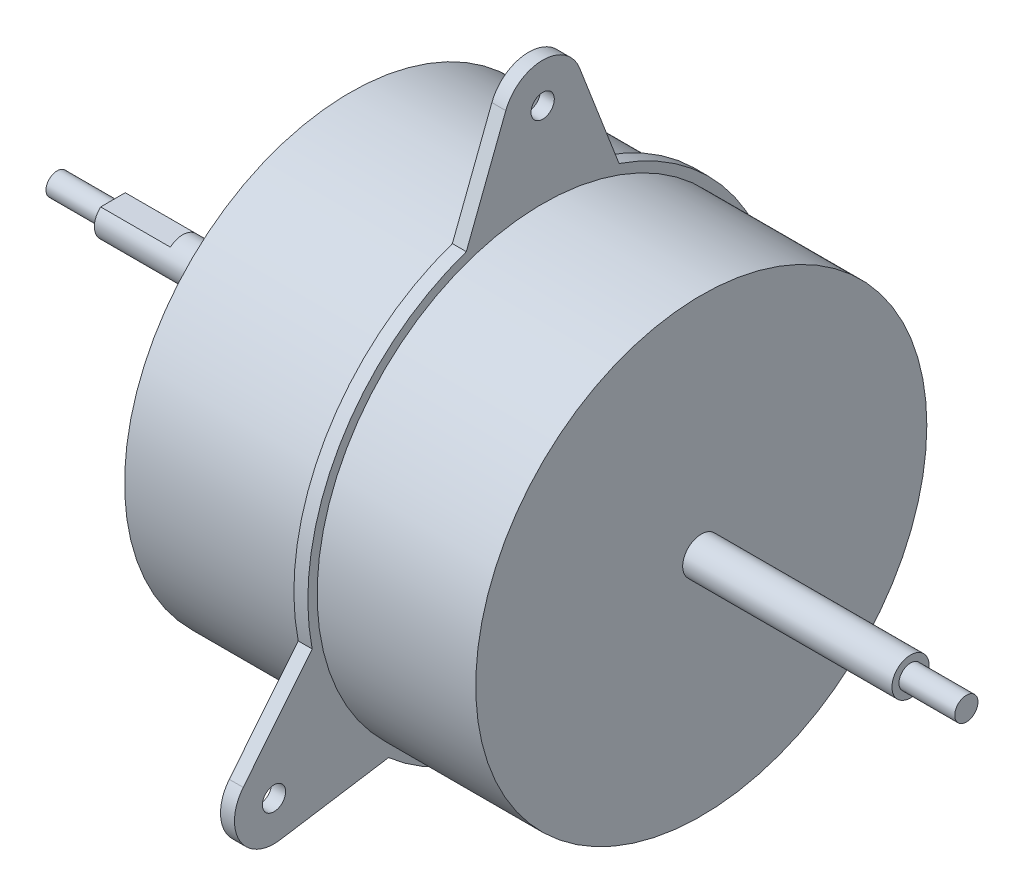
ISO-10303-21;
HEADER;
FILE_DESCRIPTION(('STEP AP214'),'2;1');
FILE_NAME('part.step','',(''),(''),'','','');
FILE_SCHEMA(('AUTOMOTIVE_DESIGN { 1 0 10303 214 1 1 1 1 }'));
ENDSEC;
DATA;
#1=APPLICATION_CONTEXT('core data for automotive mechanical design processes');
#2=APPLICATION_PROTOCOL_DEFINITION('international standard','automotive_design',2000,#1);
#3=PRODUCT_CONTEXT('',#1,'mechanical');
#4=PRODUCT('Part','Part','',(#3));
#5=PRODUCT_RELATED_PRODUCT_CATEGORY('part','',(#4));
#6=PRODUCT_DEFINITION_FORMATION('','',#4);
#7=PRODUCT_DEFINITION_CONTEXT('part definition',#1,'design');
#8=PRODUCT_DEFINITION('design','',#6,#7);
#9=PRODUCT_DEFINITION_SHAPE('','',#8);
#10=(LENGTH_UNIT() NAMED_UNIT(*) SI_UNIT(.MILLI.,.METRE.));
#11=(NAMED_UNIT(*) PLANE_ANGLE_UNIT() SI_UNIT($,.RADIAN.));
#12=(NAMED_UNIT(*) SI_UNIT($,.STERADIAN.) SOLID_ANGLE_UNIT());
#13=UNCERTAINTY_MEASURE_WITH_UNIT(LENGTH_MEASURE(1.E-05),#10,'distance_accuracy_value','');
#14=(GEOMETRIC_REPRESENTATION_CONTEXT(3) GLOBAL_UNCERTAINTY_ASSIGNED_CONTEXT((#13)) GLOBAL_UNIT_ASSIGNED_CONTEXT((#10,
#11,#12)) REPRESENTATION_CONTEXT('',''));
#15=CARTESIAN_POINT('',(0.,0.,0.));
#16=DIRECTION('',(0.,0.,1.));
#17=DIRECTION('',(1.,0.,0.));
#18=AXIS2_PLACEMENT_3D('',#15,#16,#17);
#19=CARTESIAN_POINT('',(94.1,2.5,0.));
#20=DIRECTION('',(1.,0.,0.));
#21=DIRECTION('',(0.,0.,-1.));
#22=AXIS2_PLACEMENT_3D('',#19,#20,#21);
#23=PLANE('',#22);
#24=CARTESIAN_POINT('',(94.1,0.,0.));
#25=DIRECTION('',(1.,0.,0.));
#26=DIRECTION('',(0.,0.,-1.));
#27=AXIS2_PLACEMENT_3D('',#24,#25,#26);
#28=CIRCLE('',#27,2.5);
#29=CARTESIAN_POINT('',(94.1,0.,-2.5));
#30=VERTEX_POINT('',#29);
#31=EDGE_CURVE('E231',#30,#30,#28,.T.);
#32=ORIENTED_EDGE('',*,*,#31,.T.);
#33=EDGE_LOOP('',(#32));
#34=FACE_BOUND('',#33,.T.);
#35=ADVANCED_FACE('F33',(#34),#23,.T.);
#36=CARTESIAN_POINT('',(0.,0.,0.));
#37=DIRECTION('',(1.,0.,0.));
#38=DIRECTION('',(0.,0.,-1.));
#39=AXIS2_PLACEMENT_3D('',#36,#37,#38);
#40=CYLINDRICAL_SURFACE('',#39,2.5);
#41=CARTESIAN_POINT('',(82.1,0.,0.));
#42=DIRECTION('',(1.,0.,0.));
#43=DIRECTION('',(0.,0.,-1.));
#44=AXIS2_PLACEMENT_3D('',#41,#42,#43);
#45=CIRCLE('',#44,2.5);
#46=CARTESIAN_POINT('',(82.1,0.,-2.5));
#47=VERTEX_POINT('',#46);
#48=EDGE_CURVE('E228',#47,#47,#45,.T.);
#49=ORIENTED_EDGE('',*,*,#48,.T.);
#50=EDGE_LOOP('',(#49));
#51=FACE_BOUND('',#50,.T.);
#52=ORIENTED_EDGE('',*,*,#31,.F.);
#53=EDGE_LOOP('',(#52));
#54=FACE_BOUND('',#53,.T.);
#55=ADVANCED_FACE('F348',(#51,#54),#40,.T.);
#56=CARTESIAN_POINT('',(82.1,4.,0.));
#57=DIRECTION('',(1.,0.,0.));
#58=DIRECTION('',(0.,0.,-1.));
#59=AXIS2_PLACEMENT_3D('',#56,#57,#58);
#60=PLANE('',#59);
#61=CARTESIAN_POINT('',(82.1,0.,0.));
#62=DIRECTION('',(1.,0.,0.));
#63=DIRECTION('',(0.,0.,-1.));
#64=AXIS2_PLACEMENT_3D('',#61,#62,#63);
#65=CIRCLE('',#64,4.);
#66=CARTESIAN_POINT('',(82.1,0.,-4.));
#67=VERTEX_POINT('',#66);
#68=EDGE_CURVE('E225',#67,#67,#65,.T.);
#69=ORIENTED_EDGE('',*,*,#68,.T.);
#70=EDGE_LOOP('',(#69));
#71=FACE_BOUND('',#70,.T.);
#72=ORIENTED_EDGE('',*,*,#48,.F.);
#73=EDGE_LOOP('',(#72));
#74=FACE_BOUND('',#73,.T.);
#75=ADVANCED_FACE('F354',(#71,#74),#60,.T.);
#76=CARTESIAN_POINT('',(0.,0.,0.));
#77=DIRECTION('',(1.,0.,0.));
#78=DIRECTION('',(0.,0.,-1.));
#79=AXIS2_PLACEMENT_3D('',#76,#77,#78);
#80=CYLINDRICAL_SURFACE('',#79,4.);
#81=CARTESIAN_POINT('',(37.1,0.,0.));
#82=DIRECTION('',(1.,0.,0.));
#83=DIRECTION('',(0.,0.,-1.));
#84=AXIS2_PLACEMENT_3D('',#81,#82,#83);
#85=CIRCLE('',#84,4.);
#86=CARTESIAN_POINT('',(37.1,0.,-4.));
#87=VERTEX_POINT('',#86);
#88=EDGE_CURVE('E222',#87,#87,#85,.T.);
#89=ORIENTED_EDGE('',*,*,#88,.T.);
#90=EDGE_LOOP('',(#89));
#91=FACE_BOUND('',#90,.T.);
#92=ORIENTED_EDGE('',*,*,#68,.F.);
#93=EDGE_LOOP('',(#92));
#94=FACE_BOUND('',#93,.T.);
#95=ADVANCED_FACE('F407',(#91,#94),#80,.T.);
#96=CARTESIAN_POINT('',(37.1,48.5,0.));
#97=DIRECTION('',(1.,0.,0.));
#98=DIRECTION('',(0.,0.,-1.));
#99=AXIS2_PLACEMENT_3D('',#96,#97,#98);
#100=PLANE('',#99);
#101=CARTESIAN_POINT('',(37.1,0.,0.));
#102=DIRECTION('',(1.,0.,0.));
#103=DIRECTION('',(0.,0.,-1.));
#104=AXIS2_PLACEMENT_3D('',#101,#102,#103);
#105=CIRCLE('',#104,48.5);
#106=CARTESIAN_POINT('',(37.1,0.,-48.5));
#107=VERTEX_POINT('',#106);
#108=EDGE_CURVE('E219',#107,#107,#105,.T.);
#109=ORIENTED_EDGE('',*,*,#108,.T.);
#110=EDGE_LOOP('',(#109));
#111=FACE_BOUND('',#110,.T.);
#112=ORIENTED_EDGE('',*,*,#88,.F.);
#113=EDGE_LOOP('',(#112));
#114=FACE_BOUND('',#113,.T.);
#115=ADVANCED_FACE('F399',(#111,#114),#100,.T.);
#116=CARTESIAN_POINT('',(0.,0.,0.));
#117=DIRECTION('',(1.,0.,0.));
#118=DIRECTION('',(0.,0.,-1.));
#119=AXIS2_PLACEMENT_3D('',#116,#117,#118);
#120=CYLINDRICAL_SURFACE('',#119,48.5);
#121=CARTESIAN_POINT('',(3.,0.,0.));
#122=DIRECTION('',(1.,0.,0.));
#123=DIRECTION('',(0.,0.,-1.));
#124=AXIS2_PLACEMENT_3D('',#121,#122,#123);
#125=CIRCLE('',#124,48.5);
#126=CARTESIAN_POINT('',(3.,0.,-48.5));
#127=VERTEX_POINT('',#126);
#128=EDGE_CURVE('E11',#127,#127,#125,.F.);
#129=ORIENTED_EDGE('',*,*,#128,.F.);
#130=EDGE_LOOP('',(#129));
#131=FACE_BOUND('',#130,.T.);
#132=ORIENTED_EDGE('',*,*,#108,.F.);
#133=EDGE_LOOP('',(#132));
#134=FACE_BOUND('',#133,.T.);
#135=ADVANCED_FACE('F389',(#131,#134),#120,.T.);
#136=CARTESIAN_POINT('',(3.,66.7128236048613,0.));
#137=DIRECTION('',(1.,0.,0.));
#138=DIRECTION('',(0.,0.,-1.));
#139=AXIS2_PLACEMENT_3D('',#136,#137,#138);
#140=PLANE('',#139);
#141=ORIENTED_EDGE('',*,*,#128,.T.);
#142=EDGE_LOOP('',(#141));
#143=FACE_BOUND('',#142,.T.);
#144=CARTESIAN_POINT('',(3.,-33.3564118024306,-57.775));
#145=DIRECTION('',(1.,0.,0.));
#146=DIRECTION('',(0.,0.,-1.));
#147=AXIS2_PLACEMENT_3D('',#144,#145,#146);
#148=CIRCLE('',#147,2.5);
#149=CARTESIAN_POINT('',(3.,-33.3564118024306,-60.275));
#150=VERTEX_POINT('',#149);
#151=EDGE_CURVE('E281',#150,#150,#148,.T.);
#152=ORIENTED_EDGE('',*,*,#151,.F.);
#153=EDGE_LOOP('',(#152));
#154=FACE_BOUND('',#153,.T.);
#155=CARTESIAN_POINT('',(3.,66.7128236048613,0.));
#156=DIRECTION('',(1.,0.,0.));
#157=DIRECTION('',(0.,0.,-1.));
#158=AXIS2_PLACEMENT_3D('',#155,#156,#157);
#159=CIRCLE('',#158,8.50000000000001);
#160=CARTESIAN_POINT('',(3.,69.7715028253181,-7.93060410223244));
#161=VERTEX_POINT('',#160);
#162=CARTESIAN_POINT('',(3.,69.771502825318,7.93060410223244));
#163=VERTEX_POINT('',#162);
#164=EDGE_CURVE('E191',#161,#163,#159,.T.);
#165=ORIENTED_EDGE('',*,*,#164,.T.);
#166=DIRECTION('',(0.,-0.933012247321463,0.359844614171387));
#167=VECTOR('',#166,1.);
#168=CARTESIAN_POINT('',(3.,69.771502825318,7.93060410223244));
#169=LINE('',#168,#167);
#170=CARTESIAN_POINT('',(3.,47.7553606400767,16.42180045355));
#171=VERTEX_POINT('',#170);
#172=EDGE_CURVE('E110',#163,#171,#169,.T.);
#173=ORIENTED_EDGE('',*,*,#172,.T.);
#174=CARTESIAN_POINT('',(3.,0.,0.));
#175=DIRECTION('',(1.,0.,0.));
#176=DIRECTION('',(0.,0.,-1.));
#177=AXIS2_PLACEMENT_3D('',#174,#175,#176);
#178=CIRCLE('',#177,50.5);
#179=CARTESIAN_POINT('',(3.,-9.65598395138592,49.5682557079688));
#180=VERTEX_POINT('',#179);
#181=EDGE_CURVE('E290',#171,#180,#178,.T.);
#182=ORIENTED_EDGE('',*,*,#181,.T.);
#183=DIRECTION('',(0.,-0.778140700948149,0.628090001136718));
#184=VECTOR('',#183,1.);
#185=CARTESIAN_POINT('',(3.,-28.0176467927686,64.3891959580592));
#186=LINE('',#185,#184);
#187=CARTESIAN_POINT('',(3.,-28.0176467927686,64.3891959580592));
#188=VERTEX_POINT('',#187);
#189=EDGE_CURVE('E292',#180,#188,#186,.T.);
#190=ORIENTED_EDGE('',*,*,#189,.T.);
#191=CARTESIAN_POINT('',(3.,-33.3564118024307,57.775));
#192=DIRECTION('',(1.,0.,0.));
#193=DIRECTION('',(0.,0.,-1.));
#194=AXIS2_PLACEMENT_3D('',#191,#192,#193);
#195=CIRCLE('',#194,8.49999999999999);
#196=CARTESIAN_POINT('',(3.,-41.7538560325494,56.4585918558269));
#197=VERTEX_POINT('',#196);
#198=EDGE_CURVE('E294',#188,#197,#195,.T.);
#199=ORIENTED_EDGE('',*,*,#198,.T.);
#200=DIRECTION('',(0.,0.154871546373323,-0.987934615308086));
#201=VECTOR('',#200,1.);
#202=CARTESIAN_POINT('',(3.,-41.7538560325494,56.4585918558269));
#203=LINE('',#202,#201);
#204=CARTESIAN_POINT('',(3.,-38.099376688691,33.1464552544194));
#205=VERTEX_POINT('',#204);
#206=EDGE_CURVE('E296',#197,#205,#203,.T.);
#207=ORIENTED_EDGE('',*,*,#206,.T.);
#208=CARTESIAN_POINT('',(3.,0.,0.));
#209=DIRECTION('',(1.,0.,0.));
#210=DIRECTION('',(0.,0.,-1.));
#211=AXIS2_PLACEMENT_3D('',#208,#209,#210);
#212=CIRCLE('',#211,50.5);
#213=CARTESIAN_POINT('',(3.,-38.099376688691,-33.1464552544194));
#214=VERTEX_POINT('',#213);
#215=EDGE_CURVE('E298',#205,#214,#212,.T.);
#216=ORIENTED_EDGE('',*,*,#215,.T.);
#217=DIRECTION('',(0.,-0.154871546373322,-0.987934615308086));
#218=VECTOR('',#217,1.);
#219=CARTESIAN_POINT('',(3.,-41.7538560325494,-56.4585918558269));
#220=LINE('',#219,#218);
#221=CARTESIAN_POINT('',(3.,-41.7538560325494,-56.4585918558269));
#222=VERTEX_POINT('',#221);
#223=EDGE_CURVE('E300',#214,#222,#220,.T.);
#224=ORIENTED_EDGE('',*,*,#223,.T.);
#225=CARTESIAN_POINT('',(3.,-33.3564118024306,-57.775));
#226=DIRECTION('',(1.,0.,0.));
#227=DIRECTION('',(0.,0.,-1.));
#228=AXIS2_PLACEMENT_3D('',#225,#226,#227);
#229=CIRCLE('',#228,8.5);
#230=CARTESIAN_POINT('',(3.,-28.0176467927686,-64.3891959580594));
#231=VERTEX_POINT('',#230);
#232=EDGE_CURVE('E146',#222,#231,#229,.T.);
#233=ORIENTED_EDGE('',*,*,#232,.T.);
#234=DIRECTION('',(0.,0.778140700948149,0.628090001136719));
#235=VECTOR('',#234,1.);
#236=CARTESIAN_POINT('',(3.,-28.0176467927687,-64.3891959580594));
#237=LINE('',#236,#235);
#238=CARTESIAN_POINT('',(3.,-9.65598395138591,-49.5682557079688));
#239=VERTEX_POINT('',#238);
#240=EDGE_CURVE('E138',#231,#239,#237,.T.);
#241=ORIENTED_EDGE('',*,*,#240,.T.);
#242=CARTESIAN_POINT('',(3.,0.,0.));
#243=DIRECTION('',(1.,0.,0.));
#244=DIRECTION('',(0.,0.,-1.));
#245=AXIS2_PLACEMENT_3D('',#242,#243,#244);
#246=CIRCLE('',#245,50.5);
#247=CARTESIAN_POINT('',(3.,47.7553606400767,-16.42180045355));
#248=VERTEX_POINT('',#247);
#249=EDGE_CURVE('E143',#239,#248,#246,.T.);
#250=ORIENTED_EDGE('',*,*,#249,.T.);
#251=DIRECTION('',(0.,0.933012247321462,0.359844614171386));
#252=VECTOR('',#251,1.);
#253=CARTESIAN_POINT('',(3.,69.7715028253181,-7.93060410223244));
#254=LINE('',#253,#252);
#255=EDGE_CURVE('E56',#248,#161,#254,.T.);
#256=ORIENTED_EDGE('',*,*,#255,.T.);
#257=EDGE_LOOP('',(#165,#173,#182,#190,#199,#207,#216,#224,#233,#241,#250,#256));
#258=FACE_BOUND('',#257,.T.);
#259=CARTESIAN_POINT('',(3.,66.7128236048613,0.));
#260=DIRECTION('',(1.,0.,0.));
#261=DIRECTION('',(0.,0.,-1.));
#262=AXIS2_PLACEMENT_3D('',#259,#260,#261);
#263=CIRCLE('',#262,2.5);
#264=CARTESIAN_POINT('',(3.,66.7128236048613,-2.5));
#265=VERTEX_POINT('',#264);
#266=EDGE_CURVE('E171',#265,#265,#263,.T.);
#267=ORIENTED_EDGE('',*,*,#266,.F.);
#268=EDGE_LOOP('',(#267));
#269=FACE_BOUND('',#268,.T.);
#270=CARTESIAN_POINT('',(3.,-33.3564118024307,57.775));
#271=DIRECTION('',(1.,0.,0.));
#272=DIRECTION('',(0.,0.,-1.));
#273=AXIS2_PLACEMENT_3D('',#270,#271,#272);
#274=CIRCLE('',#273,2.5);
#275=CARTESIAN_POINT('',(3.,-33.3564118024307,55.275));
#276=VERTEX_POINT('',#275);
#277=EDGE_CURVE('E271',#276,#276,#274,.T.);
#278=ORIENTED_EDGE('',*,*,#277,.F.);
#279=EDGE_LOOP('',(#278));
#280=FACE_BOUND('',#279,.T.);
#281=ADVANCED_FACE('F140',(#143,#154,#258,#269,#280),#140,.T.);
#282=CARTESIAN_POINT('',(0.,66.7128236048613,0.));
#283=DIRECTION('',(1.,0.,0.));
#284=DIRECTION('',(0.,0.,-1.));
#285=AXIS2_PLACEMENT_3D('',#282,#283,#284);
#286=PLANE('',#285);
#287=CARTESIAN_POINT('',(0.,0.,0.));
#288=DIRECTION('',(1.,0.,0.));
#289=DIRECTION('',(0.,0.,-1.));
#290=AXIS2_PLACEMENT_3D('',#287,#288,#289);
#291=CIRCLE('',#290,48.5);
#292=CARTESIAN_POINT('',(0.,0.,-48.5));
#293=VERTEX_POINT('',#292);
#294=EDGE_CURVE('E218',#293,#293,#291,.F.);
#295=ORIENTED_EDGE('',*,*,#294,.F.);
#296=EDGE_LOOP('',(#295));
#297=FACE_BOUND('',#296,.T.);
#298=CARTESIAN_POINT('',(0.,66.7128236048613,0.));
#299=DIRECTION('',(1.,0.,0.));
#300=DIRECTION('',(0.,0.,-1.));
#301=AXIS2_PLACEMENT_3D('',#298,#299,#300);
#302=CIRCLE('',#301,8.50000000000001);
#303=CARTESIAN_POINT('',(0.,69.7715028253181,-7.93060410223244));
#304=VERTEX_POINT('',#303);
#305=CARTESIAN_POINT('',(0.,69.771502825318,7.93060410223244));
#306=VERTEX_POINT('',#305);
#307=EDGE_CURVE('E167',#304,#306,#302,.T.);
#308=ORIENTED_EDGE('',*,*,#307,.F.);
#309=DIRECTION('',(0.,0.933012247321462,0.359844614171386));
#310=VECTOR('',#309,1.);
#311=CARTESIAN_POINT('',(0.,69.7715028253181,-7.93060410223244));
#312=LINE('',#311,#310);
#313=CARTESIAN_POINT('',(0.,47.7553606400767,-16.42180045355));
#314=VERTEX_POINT('',#313);
#315=EDGE_CURVE('E101',#314,#304,#312,.T.);
#316=ORIENTED_EDGE('',*,*,#315,.F.);
#317=CARTESIAN_POINT('',(0.,0.,0.));
#318=DIRECTION('',(1.,0.,0.));
#319=DIRECTION('',(0.,0.,-1.));
#320=AXIS2_PLACEMENT_3D('',#317,#318,#319);
#321=CIRCLE('',#320,50.5);
#322=CARTESIAN_POINT('',(0.,-9.65598395138591,-49.5682557079688));
#323=VERTEX_POINT('',#322);
#324=EDGE_CURVE('E188',#323,#314,#321,.T.);
#325=ORIENTED_EDGE('',*,*,#324,.F.);
#326=DIRECTION('',(0.,0.778140700948149,0.628090001136719));
#327=VECTOR('',#326,1.);
#328=CARTESIAN_POINT('',(0.,-28.0176467927687,-64.3891959580594));
#329=LINE('',#328,#327);
#330=CARTESIAN_POINT('',(0.,-28.0176467927686,-64.3891959580594));
#331=VERTEX_POINT('',#330);
#332=EDGE_CURVE('E155',#331,#323,#329,.T.);
#333=ORIENTED_EDGE('',*,*,#332,.F.);
#334=CARTESIAN_POINT('',(0.,-33.3564118024306,-57.775));
#335=DIRECTION('',(1.,0.,0.));
#336=DIRECTION('',(0.,0.,-1.));
#337=AXIS2_PLACEMENT_3D('',#334,#335,#336);
#338=CIRCLE('',#337,8.5);
#339=CARTESIAN_POINT('',(0.,-41.7538560325494,-56.4585918558269));
#340=VERTEX_POINT('',#339);
#341=EDGE_CURVE('E185',#340,#331,#338,.T.);
#342=ORIENTED_EDGE('',*,*,#341,.F.);
#343=DIRECTION('',(0.,-0.154871546373322,-0.987934615308086));
#344=VECTOR('',#343,1.);
#345=CARTESIAN_POINT('',(0.,-41.7538560325494,-56.4585918558269));
#346=LINE('',#345,#344);
#347=CARTESIAN_POINT('',(0.,-38.099376688691,-33.1464552544194));
#348=VERTEX_POINT('',#347);
#349=EDGE_CURVE('E183',#348,#340,#346,.T.);
#350=ORIENTED_EDGE('',*,*,#349,.F.);
#351=CARTESIAN_POINT('',(0.,0.,0.));
#352=DIRECTION('',(1.,0.,0.));
#353=DIRECTION('',(0.,0.,-1.));
#354=AXIS2_PLACEMENT_3D('',#351,#352,#353);
#355=CIRCLE('',#354,50.5);
#356=CARTESIAN_POINT('',(0.,-38.099376688691,33.1464552544194));
#357=VERTEX_POINT('',#356);
#358=EDGE_CURVE('E181',#357,#348,#355,.T.);
#359=ORIENTED_EDGE('',*,*,#358,.F.);
#360=DIRECTION('',(0.,0.154871546373323,-0.987934615308086));
#361=VECTOR('',#360,1.);
#362=CARTESIAN_POINT('',(0.,-41.7538560325494,56.4585918558269));
#363=LINE('',#362,#361);
#364=CARTESIAN_POINT('',(0.,-41.7538560325494,56.4585918558269));
#365=VERTEX_POINT('',#364);
#366=EDGE_CURVE('E179',#365,#357,#363,.T.);
#367=ORIENTED_EDGE('',*,*,#366,.F.);
#368=CARTESIAN_POINT('',(0.,-33.3564118024307,57.775));
#369=DIRECTION('',(1.,0.,0.));
#370=DIRECTION('',(0.,0.,-1.));
#371=AXIS2_PLACEMENT_3D('',#368,#369,#370);
#372=CIRCLE('',#371,8.49999999999999);
#373=CARTESIAN_POINT('',(0.,-28.0176467927686,64.3891959580592));
#374=VERTEX_POINT('',#373);
#375=EDGE_CURVE('E177',#374,#365,#372,.T.);
#376=ORIENTED_EDGE('',*,*,#375,.F.);
#377=DIRECTION('',(0.,-0.778140700948149,0.628090001136718));
#378=VECTOR('',#377,1.);
#379=CARTESIAN_POINT('',(0.,-28.0176467927686,64.3891959580592));
#380=LINE('',#379,#378);
#381=CARTESIAN_POINT('',(0.,-9.65598395138592,49.5682557079688));
#382=VERTEX_POINT('',#381);
#383=EDGE_CURVE('E175',#382,#374,#380,.T.);
#384=ORIENTED_EDGE('',*,*,#383,.F.);
#385=CARTESIAN_POINT('',(0.,0.,0.));
#386=DIRECTION('',(1.,0.,0.));
#387=DIRECTION('',(0.,0.,-1.));
#388=AXIS2_PLACEMENT_3D('',#385,#386,#387);
#389=CIRCLE('',#388,50.5);
#390=CARTESIAN_POINT('',(0.,47.7553606400767,16.42180045355));
#391=VERTEX_POINT('',#390);
#392=EDGE_CURVE('E173',#391,#382,#389,.T.);
#393=ORIENTED_EDGE('',*,*,#392,.F.);
#394=DIRECTION('',(0.,-0.933012247321463,0.359844614171387));
#395=VECTOR('',#394,1.);
#396=CARTESIAN_POINT('',(0.,69.771502825318,7.93060410223244));
#397=LINE('',#396,#395);
#398=EDGE_CURVE('E170',#306,#391,#397,.T.);
#399=ORIENTED_EDGE('',*,*,#398,.F.);
#400=EDGE_LOOP('',(#308,#316,#325,#333,#342,#350,#359,#367,#376,#384,#393,#399));
#401=FACE_BOUND('',#400,.T.);
#402=CARTESIAN_POINT('',(0.,66.7128236048613,0.));
#403=DIRECTION('',(1.,0.,0.));
#404=DIRECTION('',(0.,0.,-1.));
#405=AXIS2_PLACEMENT_3D('',#402,#403,#404);
#406=CIRCLE('',#405,2.5);
#407=CARTESIAN_POINT('',(0.,66.7128236048613,-2.5));
#408=VERTEX_POINT('',#407);
#409=EDGE_CURVE('E262',#408,#408,#406,.T.);
#410=ORIENTED_EDGE('',*,*,#409,.T.);
#411=EDGE_LOOP('',(#410));
#412=FACE_BOUND('',#411,.T.);
#413=CARTESIAN_POINT('',(0.,-33.3564118024306,-57.775));
#414=DIRECTION('',(1.,0.,0.));
#415=DIRECTION('',(0.,0.,-1.));
#416=AXIS2_PLACEMENT_3D('',#413,#414,#415);
#417=CIRCLE('',#416,2.5);
#418=CARTESIAN_POINT('',(0.,-33.3564118024306,-60.275));
#419=VERTEX_POINT('',#418);
#420=EDGE_CURVE('E266',#419,#419,#417,.T.);
#421=ORIENTED_EDGE('',*,*,#420,.T.);
#422=EDGE_LOOP('',(#421));
#423=FACE_BOUND('',#422,.T.);
#424=CARTESIAN_POINT('',(0.,-33.3564118024307,57.775));
#425=DIRECTION('',(1.,0.,0.));
#426=DIRECTION('',(0.,0.,-1.));
#427=AXIS2_PLACEMENT_3D('',#424,#425,#426);
#428=CIRCLE('',#427,2.5);
#429=CARTESIAN_POINT('',(0.,-33.3564118024307,55.275));
#430=VERTEX_POINT('',#429);
#431=EDGE_CURVE('E269',#430,#430,#428,.T.);
#432=ORIENTED_EDGE('',*,*,#431,.T.);
#433=EDGE_LOOP('',(#432));
#434=FACE_BOUND('',#433,.T.);
#435=ADVANCED_FACE('F252',(#297,#401,#412,#423,#434),#286,.F.);
#436=CARTESIAN_POINT('',(3.,66.7128236048613,0.));
#437=DIRECTION('',(-1.,0.,0.));
#438=DIRECTION('',(0.,0.,1.));
#439=AXIS2_PLACEMENT_3D('',#436,#437,#438);
#440=CYLINDRICAL_SURFACE('',#439,8.50000000000001);
#441=ORIENTED_EDGE('',*,*,#307,.T.);
#442=DIRECTION('',(-1.,0.,0.));
#443=VECTOR('',#442,1.);
#444=CARTESIAN_POINT('',(3.,69.771502825318,7.93060410223244));
#445=LINE('',#444,#443);
#446=EDGE_CURVE('E216',#163,#306,#445,.T.);
#447=ORIENTED_EDGE('',*,*,#446,.F.);
#448=ORIENTED_EDGE('',*,*,#164,.F.);
#449=DIRECTION('',(-1.,0.,0.));
#450=VECTOR('',#449,1.);
#451=CARTESIAN_POINT('',(3.,69.7715028253181,-7.93060410223244));
#452=LINE('',#451,#450);
#453=EDGE_CURVE('E163',#161,#304,#452,.T.);
#454=ORIENTED_EDGE('',*,*,#453,.T.);
#455=EDGE_LOOP('',(#441,#447,#448,#454));
#456=FACE_BOUND('',#455,.T.);
#457=ADVANCED_FACE('F255',(#456),#440,.T.);
#458=CARTESIAN_POINT('',(3.,69.771502825318,7.93060410223244));
#459=DIRECTION('',(0.,-0.359844614171386,-0.933012247321462));
#460=DIRECTION('',(0.,0.933012247321463,-0.359844614171387));
#461=AXIS2_PLACEMENT_3D('',#458,#459,#460);
#462=PLANE('',#461);
#463=ORIENTED_EDGE('',*,*,#398,.T.);
#464=DIRECTION('',(-1.,0.,0.));
#465=VECTOR('',#464,1.);
#466=CARTESIAN_POINT('',(3.,47.7553606400767,16.42180045355));
#467=LINE('',#466,#465);
#468=EDGE_CURVE('E213',#171,#391,#467,.T.);
#469=ORIENTED_EDGE('',*,*,#468,.F.);
#470=ORIENTED_EDGE('',*,*,#172,.F.);
#471=ORIENTED_EDGE('',*,*,#446,.T.);
#472=EDGE_LOOP('',(#463,#469,#470,#471));
#473=FACE_BOUND('',#472,.T.);
#474=ADVANCED_FACE('F317',(#473),#462,.F.);
#475=CARTESIAN_POINT('',(3.,0.,0.));
#476=DIRECTION('',(-1.,0.,0.));
#477=DIRECTION('',(0.,0.,1.));
#478=AXIS2_PLACEMENT_3D('',#475,#476,#477);
#479=CYLINDRICAL_SURFACE('',#478,50.5);
#480=ORIENTED_EDGE('',*,*,#392,.T.);
#481=DIRECTION('',(-1.,0.,0.));
#482=VECTOR('',#481,1.);
#483=CARTESIAN_POINT('',(3.,-9.65598395138592,49.5682557079688));
#484=LINE('',#483,#482);
#485=EDGE_CURVE('E210',#180,#382,#484,.T.);
#486=ORIENTED_EDGE('',*,*,#485,.F.);
#487=ORIENTED_EDGE('',*,*,#181,.F.);
#488=ORIENTED_EDGE('',*,*,#468,.T.);
#489=EDGE_LOOP('',(#480,#486,#487,#488));
#490=FACE_BOUND('',#489,.T.);
#491=ADVANCED_FACE('F320',(#490),#479,.T.);
#492=CARTESIAN_POINT('',(3.,-28.0176467927686,64.3891959580592));
#493=DIRECTION('',(0.,-0.628090001136718,-0.778140700948149));
#494=DIRECTION('',(0.,0.778140700948149,-0.628090001136718));
#495=AXIS2_PLACEMENT_3D('',#492,#493,#494);
#496=PLANE('',#495);
#497=ORIENTED_EDGE('',*,*,#383,.T.);
#498=DIRECTION('',(-1.,0.,0.));
#499=VECTOR('',#498,1.);
#500=CARTESIAN_POINT('',(3.,-28.0176467927686,64.3891959580592));
#501=LINE('',#500,#499);
#502=EDGE_CURVE('E207',#188,#374,#501,.T.);
#503=ORIENTED_EDGE('',*,*,#502,.F.);
#504=ORIENTED_EDGE('',*,*,#189,.F.);
#505=ORIENTED_EDGE('',*,*,#485,.T.);
#506=EDGE_LOOP('',(#497,#503,#504,#505));
#507=FACE_BOUND('',#506,.T.);
#508=ADVANCED_FACE('F325',(#507),#496,.F.);
#509=CARTESIAN_POINT('',(3.,-33.3564118024307,57.775));
#510=DIRECTION('',(-1.,0.,0.));
#511=DIRECTION('',(0.,0.,1.));
#512=AXIS2_PLACEMENT_3D('',#509,#510,#511);
#513=CYLINDRICAL_SURFACE('',#512,8.49999999999999);
#514=ORIENTED_EDGE('',*,*,#375,.T.);
#515=DIRECTION('',(-1.,0.,0.));
#516=VECTOR('',#515,1.);
#517=CARTESIAN_POINT('',(3.,-41.7538560325494,56.4585918558269));
#518=LINE('',#517,#516);
#519=EDGE_CURVE('E204',#197,#365,#518,.T.);
#520=ORIENTED_EDGE('',*,*,#519,.F.);
#521=ORIENTED_EDGE('',*,*,#198,.F.);
#522=ORIENTED_EDGE('',*,*,#502,.T.);
#523=EDGE_LOOP('',(#514,#520,#521,#522));
#524=FACE_BOUND('',#523,.T.);
#525=ADVANCED_FACE('F331',(#524),#513,.T.);
#526=CARTESIAN_POINT('',(3.,-41.7538560325494,56.4585918558269));
#527=DIRECTION('',(0.,0.987934615308086,0.154871546373323));
#528=DIRECTION('',(0.,-0.154871546373323,0.987934615308086));
#529=AXIS2_PLACEMENT_3D('',#526,#527,#528);
#530=PLANE('',#529);
#531=ORIENTED_EDGE('',*,*,#366,.T.);
#532=DIRECTION('',(-1.,0.,0.));
#533=VECTOR('',#532,1.);
#534=CARTESIAN_POINT('',(3.,-38.099376688691,33.1464552544194));
#535=LINE('',#534,#533);
#536=EDGE_CURVE('E201',#205,#357,#535,.T.);
#537=ORIENTED_EDGE('',*,*,#536,.F.);
#538=ORIENTED_EDGE('',*,*,#206,.F.);
#539=ORIENTED_EDGE('',*,*,#519,.T.);
#540=EDGE_LOOP('',(#531,#537,#538,#539));
#541=FACE_BOUND('',#540,.T.);
#542=ADVANCED_FACE('F335',(#541),#530,.F.);
#543=CARTESIAN_POINT('',(3.,0.,0.));
#544=DIRECTION('',(-1.,0.,0.));
#545=DIRECTION('',(0.,0.,1.));
#546=AXIS2_PLACEMENT_3D('',#543,#544,#545);
#547=CYLINDRICAL_SURFACE('',#546,50.5);
#548=ORIENTED_EDGE('',*,*,#358,.T.);
#549=DIRECTION('',(-1.,0.,0.));
#550=VECTOR('',#549,1.);
#551=CARTESIAN_POINT('',(3.,-38.099376688691,-33.1464552544194));
#552=LINE('',#551,#550);
#553=EDGE_CURVE('E198',#214,#348,#552,.T.);
#554=ORIENTED_EDGE('',*,*,#553,.F.);
#555=ORIENTED_EDGE('',*,*,#215,.F.);
#556=ORIENTED_EDGE('',*,*,#536,.T.);
#557=EDGE_LOOP('',(#548,#554,#555,#556));
#558=FACE_BOUND('',#557,.T.);
#559=ADVANCED_FACE('F338',(#558),#547,.T.);
#560=CARTESIAN_POINT('',(3.,-41.7538560325494,-56.4585918558269));
#561=DIRECTION('',(0.,0.987934615308086,-0.154871546373322));
#562=DIRECTION('',(0.,0.154871546373322,0.987934615308086));
#563=AXIS2_PLACEMENT_3D('',#560,#561,#562);
#564=PLANE('',#563);
#565=ORIENTED_EDGE('',*,*,#349,.T.);
#566=DIRECTION('',(-1.,0.,0.));
#567=VECTOR('',#566,1.);
#568=CARTESIAN_POINT('',(3.,-41.7538560325494,-56.4585918558269));
#569=LINE('',#568,#567);
#570=EDGE_CURVE('E195',#222,#340,#569,.T.);
#571=ORIENTED_EDGE('',*,*,#570,.F.);
#572=ORIENTED_EDGE('',*,*,#223,.F.);
#573=ORIENTED_EDGE('',*,*,#553,.T.);
#574=EDGE_LOOP('',(#565,#571,#572,#573));
#575=FACE_BOUND('',#574,.T.);
#576=ADVANCED_FACE('F306',(#575),#564,.F.);
#577=CARTESIAN_POINT('',(3.,-33.3564118024306,-57.775));
#578=DIRECTION('',(-1.,0.,0.));
#579=DIRECTION('',(0.,0.,1.));
#580=AXIS2_PLACEMENT_3D('',#577,#578,#579);
#581=CYLINDRICAL_SURFACE('',#580,8.5);
#582=ORIENTED_EDGE('',*,*,#341,.T.);
#583=DIRECTION('',(-1.,0.,0.));
#584=VECTOR('',#583,1.);
#585=CARTESIAN_POINT('',(3.,-28.0176467927686,-64.3891959580594));
#586=LINE('',#585,#584);
#587=EDGE_CURVE('E158',#231,#331,#586,.T.);
#588=ORIENTED_EDGE('',*,*,#587,.F.);
#589=ORIENTED_EDGE('',*,*,#232,.F.);
#590=ORIENTED_EDGE('',*,*,#570,.T.);
#591=EDGE_LOOP('',(#582,#588,#589,#590));
#592=FACE_BOUND('',#591,.T.);
#593=ADVANCED_FACE('F310',(#592),#581,.T.);
#594=CARTESIAN_POINT('',(3.,-28.0176467927687,-64.3891959580594));
#595=DIRECTION('',(0.,-0.628090001136719,0.778140700948149));
#596=DIRECTION('',(0.,-0.778140700948149,-0.628090001136719));
#597=AXIS2_PLACEMENT_3D('',#594,#595,#596);
#598=PLANE('',#597);
#599=ORIENTED_EDGE('',*,*,#332,.T.);
#600=DIRECTION('',(-1.,0.,0.));
#601=VECTOR('',#600,1.);
#602=CARTESIAN_POINT('',(3.,-9.65598395138591,-49.5682557079688));
#603=LINE('',#602,#601);
#604=EDGE_CURVE('E152',#239,#323,#603,.T.);
#605=ORIENTED_EDGE('',*,*,#604,.F.);
#606=ORIENTED_EDGE('',*,*,#240,.F.);
#607=ORIENTED_EDGE('',*,*,#587,.T.);
#608=EDGE_LOOP('',(#599,#605,#606,#607));
#609=FACE_BOUND('',#608,.T.);
#610=ADVANCED_FACE('F153',(#609),#598,.F.);
#611=CARTESIAN_POINT('',(3.,0.,0.));
#612=DIRECTION('',(-1.,0.,0.));
#613=DIRECTION('',(0.,0.,1.));
#614=AXIS2_PLACEMENT_3D('',#611,#612,#613);
#615=CYLINDRICAL_SURFACE('',#614,50.5);
#616=ORIENTED_EDGE('',*,*,#324,.T.);
#617=DIRECTION('',(-1.,0.,0.));
#618=VECTOR('',#617,1.);
#619=CARTESIAN_POINT('',(3.,47.7553606400767,-16.42180045355));
#620=LINE('',#619,#618);
#621=EDGE_CURVE('E159',#248,#314,#620,.T.);
#622=ORIENTED_EDGE('',*,*,#621,.F.);
#623=ORIENTED_EDGE('',*,*,#249,.F.);
#624=ORIENTED_EDGE('',*,*,#604,.T.);
#625=EDGE_LOOP('',(#616,#622,#623,#624));
#626=FACE_BOUND('',#625,.T.);
#627=ADVANCED_FACE('F161',(#626),#615,.T.);
#628=CARTESIAN_POINT('',(3.,69.7715028253181,-7.93060410223244));
#629=DIRECTION('',(0.,-0.359844614171386,0.933012247321463));
#630=DIRECTION('',(0.,-0.933012247321463,-0.359844614171386));
#631=AXIS2_PLACEMENT_3D('',#628,#629,#630);
#632=PLANE('',#631);
#633=ORIENTED_EDGE('',*,*,#315,.T.);
#634=ORIENTED_EDGE('',*,*,#453,.F.);
#635=ORIENTED_EDGE('',*,*,#255,.F.);
#636=ORIENTED_EDGE('',*,*,#621,.T.);
#637=EDGE_LOOP('',(#633,#634,#635,#636));
#638=FACE_BOUND('',#637,.T.);
#639=ADVANCED_FACE('F311',(#638),#632,.F.);
#640=CARTESIAN_POINT('',(3.,66.7128236048613,0.));
#641=DIRECTION('',(-1.,0.,0.));
#642=DIRECTION('',(0.,0.,1.));
#643=AXIS2_PLACEMENT_3D('',#640,#641,#642);
#644=CYLINDRICAL_SURFACE('',#643,2.5);
#645=ORIENTED_EDGE('',*,*,#266,.T.);
#646=EDGE_LOOP('',(#645));
#647=FACE_BOUND('',#646,.T.);
#648=ORIENTED_EDGE('',*,*,#409,.F.);
#649=EDGE_LOOP('',(#648));
#650=FACE_BOUND('',#649,.T.);
#651=ADVANCED_FACE('F544',(#647,#650),#644,.F.);
#652=CARTESIAN_POINT('',(3.,-33.3564118024306,-57.775));
#653=DIRECTION('',(-1.,0.,0.));
#654=DIRECTION('',(0.,0.,1.));
#655=AXIS2_PLACEMENT_3D('',#652,#653,#654);
#656=CYLINDRICAL_SURFACE('',#655,2.5);
#657=ORIENTED_EDGE('',*,*,#151,.T.);
#658=EDGE_LOOP('',(#657));
#659=FACE_BOUND('',#658,.T.);
#660=ORIENTED_EDGE('',*,*,#420,.F.);
#661=EDGE_LOOP('',(#660));
#662=FACE_BOUND('',#661,.T.);
#663=ADVANCED_FACE('F553',(#659,#662),#656,.F.);
#664=CARTESIAN_POINT('',(3.,-33.3564118024307,57.775));
#665=DIRECTION('',(-1.,0.,0.));
#666=DIRECTION('',(0.,0.,1.));
#667=AXIS2_PLACEMENT_3D('',#664,#665,#666);
#668=CYLINDRICAL_SURFACE('',#667,2.5);
#669=ORIENTED_EDGE('',*,*,#277,.T.);
#670=EDGE_LOOP('',(#669));
#671=FACE_BOUND('',#670,.T.);
#672=ORIENTED_EDGE('',*,*,#431,.F.);
#673=EDGE_LOOP('',(#672));
#674=FACE_BOUND('',#673,.T.);
#675=ADVANCED_FACE('F363',(#671,#674),#668,.F.);
#676=CARTESIAN_POINT('',(-101.4,2.39999999999999,0.));
#677=DIRECTION('',(-1.,0.,0.));
#678=DIRECTION('',(0.,0.,1.));
#679=AXIS2_PLACEMENT_3D('',#676,#677,#678);
#680=PLANE('',#679);
#681=CARTESIAN_POINT('',(-101.4,0.,0.));
#682=DIRECTION('',(1.,0.,0.));
#683=DIRECTION('',(0.,0.,-1.));
#684=AXIS2_PLACEMENT_3D('',#681,#682,#683);
#685=CIRCLE('',#684,2.39999999999999);
#686=CARTESIAN_POINT('',(-101.4,0.,-2.39999999999999));
#687=VERTEX_POINT('',#686);
#688=EDGE_CURVE('E234',#687,#687,#685,.T.);
#689=ORIENTED_EDGE('',*,*,#688,.F.);
#690=EDGE_LOOP('',(#689));
#691=FACE_BOUND('',#690,.T.);
#692=ADVANCED_FACE('F359',(#691),#680,.T.);
#693=CARTESIAN_POINT('',(0.,0.,0.));
#694=DIRECTION('',(1.,0.,0.));
#695=DIRECTION('',(0.,0.,-1.));
#696=AXIS2_PLACEMENT_3D('',#693,#694,#695);
#697=CYLINDRICAL_SURFACE('',#696,2.39999999999999);
#698=ORIENTED_EDGE('',*,*,#688,.T.);
#699=EDGE_LOOP('',(#698));
#700=FACE_BOUND('',#699,.T.);
#701=CARTESIAN_POINT('',(-89.4,0.,0.));
#702=DIRECTION('',(1.,0.,0.));
#703=DIRECTION('',(0.,0.,-1.));
#704=AXIS2_PLACEMENT_3D('',#701,#702,#703);
#705=CIRCLE('',#704,2.39999999999999);
#706=CARTESIAN_POINT('',(-89.4,0.,-2.39999999999999));
#707=VERTEX_POINT('',#706);
#708=EDGE_CURVE('E237',#707,#707,#705,.T.);
#709=ORIENTED_EDGE('',*,*,#708,.F.);
#710=EDGE_LOOP('',(#709));
#711=FACE_BOUND('',#710,.T.);
#712=ADVANCED_FACE('F362',(#700,#711),#697,.T.);
#713=CARTESIAN_POINT('',(-89.4,3.99999999999999,0.));
#714=DIRECTION('',(-1.,0.,0.));
#715=DIRECTION('',(0.,0.,1.));
#716=AXIS2_PLACEMENT_3D('',#713,#714,#715);
#717=PLANE('',#716);
#718=DIRECTION('',(0.,0.,1.));
#719=VECTOR('',#718,1.);
#720=CARTESIAN_POINT('',(-89.4,3.00000000000001,-2.64575131106457));
#721=LINE('',#720,#719);
#722=CARTESIAN_POINT('',(-89.4,3.00000000000001,-2.64575131106457));
#723=VERTEX_POINT('',#722);
#724=CARTESIAN_POINT('',(-89.4,3.00000000000001,2.64575131106457));
#725=VERTEX_POINT('',#724);
#726=EDGE_CURVE('E607',#723,#725,#721,.T.);
#727=ORIENTED_EDGE('',*,*,#726,.F.);
#728=CARTESIAN_POINT('',(-89.4,0.,0.));
#729=DIRECTION('',(1.,0.,0.));
#730=DIRECTION('',(0.,0.,-1.));
#731=AXIS2_PLACEMENT_3D('',#728,#729,#730);
#732=CIRCLE('',#731,3.99999999999999);
#733=EDGE_CURVE('E240',#725,#723,#732,.T.);
#734=ORIENTED_EDGE('',*,*,#733,.F.);
#735=EDGE_LOOP('',(#727,#734));
#736=FACE_BOUND('',#735,.T.);
#737=ORIENTED_EDGE('',*,*,#708,.T.);
#738=EDGE_LOOP('',(#737));
#739=FACE_BOUND('',#738,.T.);
#740=ADVANCED_FACE('F367',(#736,#739),#717,.T.);
#741=CARTESIAN_POINT('',(0.,0.,0.));
#742=DIRECTION('',(1.,0.,0.));
#743=DIRECTION('',(0.,0.,-1.));
#744=AXIS2_PLACEMENT_3D('',#741,#742,#743);
#745=CYLINDRICAL_SURFACE('',#744,4.);
#746=DIRECTION('',(-1.,0.,0.));
#747=VECTOR('',#746,1.);
#748=CARTESIAN_POINT('',(-74.4,3.00000000000001,-2.64575131106457));
#749=LINE('',#748,#747);
#750=CARTESIAN_POINT('',(-74.4,3.00000000000001,-2.64575131106457));
#751=VERTEX_POINT('',#750);
#752=EDGE_CURVE('E277',#751,#723,#749,.T.);
#753=ORIENTED_EDGE('',*,*,#752,.F.);
#754=CARTESIAN_POINT('',(-74.4,0.,0.));
#755=DIRECTION('',(-1.,0.,0.));
#756=DIRECTION('',(0.,0.,-1.));
#757=AXIS2_PLACEMENT_3D('',#754,#755,#756);
#758=CIRCLE('',#757,4.);
#759=CARTESIAN_POINT('',(-74.4,3.00000000000001,2.64575131106458));
#760=VERTEX_POINT('',#759);
#761=EDGE_CURVE('E605',#760,#751,#758,.T.);
#762=ORIENTED_EDGE('',*,*,#761,.F.);
#763=DIRECTION('',(-1.,0.,0.));
#764=VECTOR('',#763,1.);
#765=CARTESIAN_POINT('',(-74.4,3.00000000000001,2.64575131106457));
#766=LINE('',#765,#764);
#767=EDGE_CURVE('E272',#760,#725,#766,.T.);
#768=ORIENTED_EDGE('',*,*,#767,.T.);
#769=ORIENTED_EDGE('',*,*,#733,.T.);
#770=EDGE_LOOP('',(#753,#762,#768,#769));
#771=FACE_BOUND('',#770,.T.);
#772=CARTESIAN_POINT('',(-38.4,0.,0.));
#773=DIRECTION('',(1.,0.,0.));
#774=DIRECTION('',(0.,0.,-1.));
#775=AXIS2_PLACEMENT_3D('',#772,#773,#774);
#776=CIRCLE('',#775,4.);
#777=CARTESIAN_POINT('',(-38.4,0.,-4.));
#778=VERTEX_POINT('',#777);
#779=EDGE_CURVE('E243',#778,#778,#776,.T.);
#780=ORIENTED_EDGE('',*,*,#779,.F.);
#781=EDGE_LOOP('',(#780));
#782=FACE_BOUND('',#781,.T.);
#783=ADVANCED_FACE('F370',(#771,#782),#745,.T.);
#784=CARTESIAN_POINT('',(-38.4,48.5,0.));
#785=DIRECTION('',(-1.,0.,0.));
#786=DIRECTION('',(0.,0.,1.));
#787=AXIS2_PLACEMENT_3D('',#784,#785,#786);
#788=PLANE('',#787);
#789=ORIENTED_EDGE('',*,*,#779,.T.);
#790=EDGE_LOOP('',(#789));
#791=FACE_BOUND('',#790,.T.);
#792=CARTESIAN_POINT('',(-38.4,0.,0.));
#793=DIRECTION('',(1.,0.,0.));
#794=DIRECTION('',(0.,0.,-1.));
#795=AXIS2_PLACEMENT_3D('',#792,#793,#794);
#796=CIRCLE('',#795,48.5);
#797=CARTESIAN_POINT('',(-38.4,0.,-48.5));
#798=VERTEX_POINT('',#797);
#799=EDGE_CURVE('E41',#798,#798,#796,.T.);
#800=ORIENTED_EDGE('',*,*,#799,.F.);
#801=EDGE_LOOP('',(#800));
#802=FACE_BOUND('',#801,.T.);
#803=ADVANCED_FACE('F35',(#791,#802),#788,.T.);
#804=ORIENTED_EDGE('',*,*,#799,.T.);
#805=EDGE_LOOP('',(#804));
#806=FACE_BOUND('',#805,.T.);
#807=ORIENTED_EDGE('',*,*,#294,.T.);
#808=EDGE_LOOP('',(#807));
#809=FACE_BOUND('',#808,.T.);
#810=ADVANCED_FACE('F250',(#806,#809),#120,.T.);
#811=CARTESIAN_POINT('',(-74.4,3.00000000000001,-2.64575131106457));
#812=DIRECTION('',(0.,-1.,0.));
#813=DIRECTION('',(0.,0.,-1.));
#814=AXIS2_PLACEMENT_3D('',#811,#812,#813);
#815=PLANE('',#814);
#816=ORIENTED_EDGE('',*,*,#726,.T.);
#817=ORIENTED_EDGE('',*,*,#767,.F.);
#818=DIRECTION('',(0.,0.,1.));
#819=VECTOR('',#818,1.);
#820=CARTESIAN_POINT('',(-74.4,3.00000000000001,-2.64575131106457));
#821=LINE('',#820,#819);
#822=EDGE_CURVE('E47',#751,#760,#821,.T.);
#823=ORIENTED_EDGE('',*,*,#822,.F.);
#824=ORIENTED_EDGE('',*,*,#752,.T.);
#825=EDGE_LOOP('',(#816,#817,#823,#824));
#826=FACE_BOUND('',#825,.T.);
#827=ADVANCED_FACE('F387',(#826),#815,.F.);
#828=CARTESIAN_POINT('',(-74.4,0.,0.));
#829=DIRECTION('',(1.,0.,0.));
#830=DIRECTION('',(0.,0.,-1.));
#831=AXIS2_PLACEMENT_3D('',#828,#829,#830);
#832=PLANE('',#831);
#833=ORIENTED_EDGE('',*,*,#761,.T.);
#834=ORIENTED_EDGE('',*,*,#822,.T.);
#835=EDGE_LOOP('',(#833,#834));
#836=FACE_BOUND('',#835,.T.);
#837=ADVANCED_FACE('F393',(#836),#832,.F.);
#838=CLOSED_SHELL('',(#35,#55,#75,#95,#115,#135,#281,#435,#457,#474,#491,#508,#525,#542,#559,
#576,#593,#610,#627,#639,#651,#663,#675,#692,#712,#740,#783,#803,#810,#827,#837));
#839=MANIFOLD_SOLID_BREP('B2',#838);
#840=ADVANCED_BREP_SHAPE_REPRESENTATION('',(#18,#839),#14);
#841=SHAPE_DEFINITION_REPRESENTATION(#9,#840);
ENDSEC;
END-ISO-10303-21;
